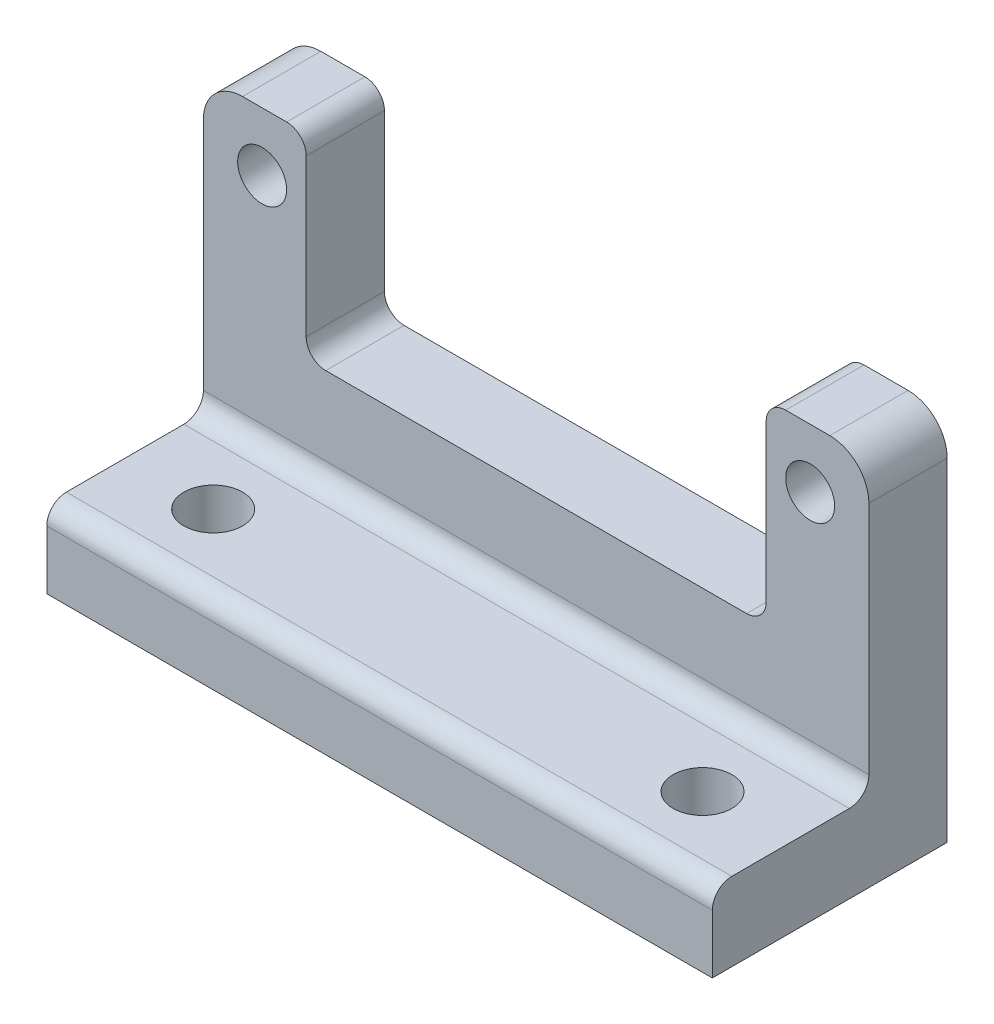
ISO-10303-21;
HEADER;
FILE_DESCRIPTION(('STEP AP214'),'2;1');
FILE_NAME('part.step','',(''),(''),'','','');
FILE_SCHEMA(('AUTOMOTIVE_DESIGN { 1 0 10303 214 1 1 1 1 }'));
ENDSEC;
DATA;
#1=APPLICATION_CONTEXT('core data for automotive mechanical design processes');
#2=APPLICATION_PROTOCOL_DEFINITION('international standard','automotive_design',2000,#1);
#3=PRODUCT_CONTEXT('',#1,'mechanical');
#4=PRODUCT('Part','Part','',(#3));
#5=PRODUCT_RELATED_PRODUCT_CATEGORY('part','',(#4));
#6=PRODUCT_DEFINITION_FORMATION('','',#4);
#7=PRODUCT_DEFINITION_CONTEXT('part definition',#1,'design');
#8=PRODUCT_DEFINITION('design','',#6,#7);
#9=PRODUCT_DEFINITION_SHAPE('','',#8);
#10=(LENGTH_UNIT() NAMED_UNIT(*) SI_UNIT(.MILLI.,.METRE.));
#11=(NAMED_UNIT(*) PLANE_ANGLE_UNIT() SI_UNIT($,.RADIAN.));
#12=(NAMED_UNIT(*) SI_UNIT($,.STERADIAN.) SOLID_ANGLE_UNIT());
#13=UNCERTAINTY_MEASURE_WITH_UNIT(LENGTH_MEASURE(1.E-05),#10,'distance_accuracy_value','');
#14=(GEOMETRIC_REPRESENTATION_CONTEXT(3) GLOBAL_UNCERTAINTY_ASSIGNED_CONTEXT((#13)) GLOBAL_UNIT_ASSIGNED_CONTEXT((#10,
#11,#12)) REPRESENTATION_CONTEXT('',''));
#15=CARTESIAN_POINT('',(0.,0.,0.));
#16=DIRECTION('',(0.,0.,1.));
#17=DIRECTION('',(1.,0.,0.));
#18=AXIS2_PLACEMENT_3D('',#15,#16,#17);
#19=CARTESIAN_POINT('',(0.,19.,0.));
#20=DIRECTION('',(0.,1.,0.));
#21=DIRECTION('',(0.,0.,1.));
#22=AXIS2_PLACEMENT_3D('',#19,#20,#21);
#23=PLANE('',#22);
#24=DIRECTION('',(-1.,0.,0.));
#25=VECTOR('',#24,1.);
#26=CARTESIAN_POINT('',(0.,19.,0.));
#27=LINE('',#26,#25);
#28=CARTESIAN_POINT('',(32.,19.,0.));
#29=VERTEX_POINT('',#28);
#30=CARTESIAN_POINT('',(29.75,19.,0.));
#31=VERTEX_POINT('',#30);
#32=EDGE_CURVE('E285',#29,#31,#27,.T.);
#33=ORIENTED_EDGE('',*,*,#32,.T.);
#34=DIRECTION('',(0.,0.,1.));
#35=VECTOR('',#34,1.);
#36=CARTESIAN_POINT('',(29.75,19.,0.));
#37=LINE('',#36,#35);
#38=CARTESIAN_POINT('',(29.75,19.,4.));
#39=VERTEX_POINT('',#38);
#40=EDGE_CURVE('E264',#31,#39,#37,.T.);
#41=ORIENTED_EDGE('',*,*,#40,.T.);
#42=DIRECTION('',(1.,0.,0.));
#43=VECTOR('',#42,1.);
#44=CARTESIAN_POINT('',(0.,19.,4.));
#45=LINE('',#44,#43);
#46=CARTESIAN_POINT('',(32.,19.,4.));
#47=VERTEX_POINT('',#46);
#48=EDGE_CURVE('E317',#39,#47,#45,.T.);
#49=ORIENTED_EDGE('',*,*,#48,.T.);
#50=DIRECTION('',(0.,0.,-1.));
#51=VECTOR('',#50,1.);
#52=CARTESIAN_POINT('',(32.,19.,0.));
#53=LINE('',#52,#51);
#54=EDGE_CURVE('E220',#47,#29,#53,.T.);
#55=ORIENTED_EDGE('',*,*,#54,.T.);
#56=EDGE_LOOP('',(#33,#41,#49,#55));
#57=FACE_BOUND('',#56,.T.);
#58=ADVANCED_FACE('F33',(#57),#23,.T.);
#59=CARTESIAN_POINT('',(0.,4.,0.));
#60=DIRECTION('',(0.,1.,0.));
#61=DIRECTION('',(0.,0.,1.));
#62=AXIS2_PLACEMENT_3D('',#59,#60,#61);
#63=PLANE('',#62);
#64=DIRECTION('',(0.,0.,-1.));
#65=VECTOR('',#64,1.);
#66=CARTESIAN_POINT('',(34.,4.,0.));
#67=LINE('',#66,#65);
#68=CARTESIAN_POINT('',(34.,4.,11.));
#69=VERTEX_POINT('',#68);
#70=CARTESIAN_POINT('',(34.,4.,5.));
#71=VERTEX_POINT('',#70);
#72=EDGE_CURVE('E192',#69,#71,#67,.T.);
#73=ORIENTED_EDGE('',*,*,#72,.T.);
#74=DIRECTION('',(1.,0.,0.));
#75=VECTOR('',#74,1.);
#76=CARTESIAN_POINT('',(0.,4.,5.));
#77=LINE('',#76,#75);
#78=CARTESIAN_POINT('',(0.,4.,5.));
#79=VERTEX_POINT('',#78);
#80=EDGE_CURVE('E54',#71,#79,#77,.F.);
#81=ORIENTED_EDGE('',*,*,#80,.T.);
#82=DIRECTION('',(0.,0.,1.));
#83=VECTOR('',#82,1.);
#84=CARTESIAN_POINT('',(0.,4.,0.));
#85=LINE('',#84,#83);
#86=CARTESIAN_POINT('',(0.,4.,11.));
#87=VERTEX_POINT('',#86);
#88=EDGE_CURVE('E198',#79,#87,#85,.T.);
#89=ORIENTED_EDGE('',*,*,#88,.T.);
#90=DIRECTION('',(1.,0.,0.));
#91=VECTOR('',#90,1.);
#92=CARTESIAN_POINT('',(34.,4.,11.));
#93=LINE('',#92,#91);
#94=EDGE_CURVE('E169',#87,#69,#93,.T.);
#95=ORIENTED_EDGE('',*,*,#94,.T.);
#96=EDGE_LOOP('',(#73,#81,#89,#95));
#97=FACE_BOUND('',#96,.T.);
#98=CARTESIAN_POINT('',(4.5,4.,8.));
#99=DIRECTION('',(0.,1.,0.));
#100=DIRECTION('',(0.,0.,1.));
#101=AXIS2_PLACEMENT_3D('',#98,#99,#100);
#102=CIRCLE('',#101,1.5);
#103=CARTESIAN_POINT('',(4.5,4.,9.5));
#104=VERTEX_POINT('',#103);
#105=EDGE_CURVE('E186',#104,#104,#102,.T.);
#106=ORIENTED_EDGE('',*,*,#105,.F.);
#107=EDGE_LOOP('',(#106));
#108=FACE_BOUND('',#107,.T.);
#109=CARTESIAN_POINT('',(29.5,4.,8.));
#110=DIRECTION('',(0.,1.,0.));
#111=DIRECTION('',(0.,0.,1.));
#112=AXIS2_PLACEMENT_3D('',#109,#110,#111);
#113=CIRCLE('',#112,1.5);
#114=CARTESIAN_POINT('',(29.5,4.,9.50000000000001));
#115=VERTEX_POINT('',#114);
#116=EDGE_CURVE('E294',#115,#115,#113,.T.);
#117=ORIENTED_EDGE('',*,*,#116,.F.);
#118=EDGE_LOOP('',(#117));
#119=FACE_BOUND('',#118,.T.);
#120=ADVANCED_FACE('F300',(#97,#108,#119),#63,.T.);
#121=CARTESIAN_POINT('',(0.,0.,0.));
#122=DIRECTION('',(0.,1.,0.));
#123=DIRECTION('',(0.,0.,1.));
#124=AXIS2_PLACEMENT_3D('',#121,#122,#123);
#125=PLANE('',#124);
#126=DIRECTION('',(0.,0.,1.));
#127=VECTOR('',#126,1.);
#128=CARTESIAN_POINT('',(0.,0.,0.));
#129=LINE('',#128,#127);
#130=CARTESIAN_POINT('',(0.,0.,0.));
#131=VERTEX_POINT('',#130);
#132=CARTESIAN_POINT('',(0.,0.,12.));
#133=VERTEX_POINT('',#132);
#134=EDGE_CURVE('E177',#131,#133,#129,.T.);
#135=ORIENTED_EDGE('',*,*,#134,.F.);
#136=DIRECTION('',(-1.,0.,0.));
#137=VECTOR('',#136,1.);
#138=CARTESIAN_POINT('',(0.,0.,0.));
#139=LINE('',#138,#137);
#140=CARTESIAN_POINT('',(34.,0.,0.));
#141=VERTEX_POINT('',#140);
#142=EDGE_CURVE('E196',#141,#131,#139,.T.);
#143=ORIENTED_EDGE('',*,*,#142,.F.);
#144=DIRECTION('',(0.,0.,-1.));
#145=VECTOR('',#144,1.);
#146=CARTESIAN_POINT('',(34.,0.,0.));
#147=LINE('',#146,#145);
#148=CARTESIAN_POINT('',(34.,0.,12.));
#149=VERTEX_POINT('',#148);
#150=EDGE_CURVE('E179',#149,#141,#147,.T.);
#151=ORIENTED_EDGE('',*,*,#150,.F.);
#152=DIRECTION('',(1.,0.,0.));
#153=VECTOR('',#152,1.);
#154=CARTESIAN_POINT('',(0.,0.,12.));
#155=LINE('',#154,#153);
#156=EDGE_CURVE('E161',#133,#149,#155,.T.);
#157=ORIENTED_EDGE('',*,*,#156,.F.);
#158=EDGE_LOOP('',(#135,#143,#151,#157));
#159=FACE_BOUND('',#158,.T.);
#160=CARTESIAN_POINT('',(4.5,0.,8.));
#161=DIRECTION('',(0.,1.,0.));
#162=DIRECTION('',(0.,0.,1.));
#163=AXIS2_PLACEMENT_3D('',#160,#161,#162);
#164=CIRCLE('',#163,1.5);
#165=CARTESIAN_POINT('',(4.5,0.,9.5));
#166=VERTEX_POINT('',#165);
#167=EDGE_CURVE('E189',#166,#166,#164,.T.);
#168=ORIENTED_EDGE('',*,*,#167,.T.);
#169=EDGE_LOOP('',(#168));
#170=FACE_BOUND('',#169,.T.);
#171=CARTESIAN_POINT('',(29.5,0.,8.));
#172=DIRECTION('',(0.,1.,0.));
#173=DIRECTION('',(0.,0.,1.));
#174=AXIS2_PLACEMENT_3D('',#171,#172,#173);
#175=CIRCLE('',#174,1.5);
#176=CARTESIAN_POINT('',(29.5,0.,9.50000000000001));
#177=VERTEX_POINT('',#176);
#178=EDGE_CURVE('E287',#177,#177,#175,.T.);
#179=ORIENTED_EDGE('',*,*,#178,.T.);
#180=EDGE_LOOP('',(#179));
#181=FACE_BOUND('',#180,.T.);
#182=ADVANCED_FACE('F174',(#159,#170,#181),#125,.F.);
#183=CARTESIAN_POINT('',(0.,4.,0.));
#184=DIRECTION('',(1.,0.,0.));
#185=DIRECTION('',(0.,0.,-1.));
#186=AXIS2_PLACEMENT_3D('',#183,#184,#185);
#187=PLANE('',#186);
#188=DIRECTION('',(0.,-1.,0.));
#189=VECTOR('',#188,1.);
#190=CARTESIAN_POINT('',(0.,19.,4.));
#191=LINE('',#190,#189);
#192=CARTESIAN_POINT('',(0.,17.,4.));
#193=VERTEX_POINT('',#192);
#194=CARTESIAN_POINT('',(0.,5.,4.));
#195=VERTEX_POINT('',#194);
#196=EDGE_CURVE('E279',#193,#195,#191,.T.);
#197=ORIENTED_EDGE('',*,*,#196,.F.);
#198=DIRECTION('',(0.,0.,1.));
#199=VECTOR('',#198,1.);
#200=CARTESIAN_POINT('',(0.,17.,0.));
#201=LINE('',#200,#199);
#202=CARTESIAN_POINT('',(0.,17.,0.));
#203=VERTEX_POINT('',#202);
#204=EDGE_CURVE('E215',#193,#203,#201,.F.);
#205=ORIENTED_EDGE('',*,*,#204,.T.);
#206=DIRECTION('',(0.,-1.,0.));
#207=VECTOR('',#206,1.);
#208=CARTESIAN_POINT('',(0.,4.,0.));
#209=LINE('',#208,#207);
#210=EDGE_CURVE('E184',#203,#131,#209,.T.);
#211=ORIENTED_EDGE('',*,*,#210,.T.);
#212=ORIENTED_EDGE('',*,*,#134,.T.);
#213=DIRECTION('',(0.,-1.,0.));
#214=VECTOR('',#213,1.);
#215=CARTESIAN_POINT('',(0.,4.,12.));
#216=LINE('',#215,#214);
#217=CARTESIAN_POINT('',(0.,3.,12.));
#218=VERTEX_POINT('',#217);
#219=EDGE_CURVE('E157',#218,#133,#216,.T.);
#220=ORIENTED_EDGE('',*,*,#219,.F.);
#221=CARTESIAN_POINT('',(0.,3.,11.));
#222=DIRECTION('',(1.,0.,0.));
#223=DIRECTION('',(0.,0.,-1.));
#224=AXIS2_PLACEMENT_3D('',#221,#222,#223);
#225=CIRCLE('',#224,1.);
#226=EDGE_CURVE('E208',#218,#87,#225,.F.);
#227=ORIENTED_EDGE('',*,*,#226,.T.);
#228=ORIENTED_EDGE('',*,*,#88,.F.);
#229=CARTESIAN_POINT('',(0.,5.,5.));
#230=DIRECTION('',(1.,0.,0.));
#231=DIRECTION('',(0.,0.,-1.));
#232=AXIS2_PLACEMENT_3D('',#229,#230,#231);
#233=CIRCLE('',#232,1.);
#234=EDGE_CURVE('E11',#79,#195,#233,.T.);
#235=ORIENTED_EDGE('',*,*,#234,.T.);
#236=EDGE_LOOP('',(#197,#205,#211,#212,#220,#227,#228,#235));
#237=FACE_BOUND('',#236,.T.);
#238=ADVANCED_FACE('F182',(#237),#187,.F.);
#239=CARTESIAN_POINT('',(0.,4.,12.));
#240=DIRECTION('',(0.,0.,-1.));
#241=DIRECTION('',(-1.,0.,0.));
#242=AXIS2_PLACEMENT_3D('',#239,#240,#241);
#243=PLANE('',#242);
#244=DIRECTION('',(0.,-1.,0.));
#245=VECTOR('',#244,1.);
#246=CARTESIAN_POINT('',(34.,4.,12.));
#247=LINE('',#246,#245);
#248=CARTESIAN_POINT('',(34.,3.,12.));
#249=VERTEX_POINT('',#248);
#250=EDGE_CURVE('E170',#249,#149,#247,.T.);
#251=ORIENTED_EDGE('',*,*,#250,.F.);
#252=DIRECTION('',(1.,0.,0.));
#253=VECTOR('',#252,1.);
#254=CARTESIAN_POINT('',(0.,3.,12.));
#255=LINE('',#254,#253);
#256=EDGE_CURVE('E164',#249,#218,#255,.F.);
#257=ORIENTED_EDGE('',*,*,#256,.T.);
#258=ORIENTED_EDGE('',*,*,#219,.T.);
#259=ORIENTED_EDGE('',*,*,#156,.T.);
#260=EDGE_LOOP('',(#251,#257,#258,#259));
#261=FACE_BOUND('',#260,.T.);
#262=ADVANCED_FACE('F160',(#261),#243,.F.);
#263=CARTESIAN_POINT('',(34.,4.,0.));
#264=DIRECTION('',(-1.,0.,0.));
#265=DIRECTION('',(0.,0.,1.));
#266=AXIS2_PLACEMENT_3D('',#263,#264,#265);
#267=PLANE('',#266);
#268=DIRECTION('',(0.,-1.,0.));
#269=VECTOR('',#268,1.);
#270=CARTESIAN_POINT('',(34.,4.,0.));
#271=LINE('',#270,#269);
#272=CARTESIAN_POINT('',(34.,17.,0.));
#273=VERTEX_POINT('',#272);
#274=EDGE_CURVE('E200',#273,#141,#271,.T.);
#275=ORIENTED_EDGE('',*,*,#274,.F.);
#276=DIRECTION('',(0.,0.,-1.));
#277=VECTOR('',#276,1.);
#278=CARTESIAN_POINT('',(34.,17.,4.));
#279=LINE('',#278,#277);
#280=CARTESIAN_POINT('',(34.,17.,4.));
#281=VERTEX_POINT('',#280);
#282=EDGE_CURVE('E225',#273,#281,#279,.F.);
#283=ORIENTED_EDGE('',*,*,#282,.T.);
#284=DIRECTION('',(0.,-1.,0.));
#285=VECTOR('',#284,1.);
#286=CARTESIAN_POINT('',(34.,19.,4.));
#287=LINE('',#286,#285);
#288=CARTESIAN_POINT('',(34.,5.,4.));
#289=VERTEX_POINT('',#288);
#290=EDGE_CURVE('E277',#281,#289,#287,.T.);
#291=ORIENTED_EDGE('',*,*,#290,.T.);
#292=CARTESIAN_POINT('',(34.,5.,5.));
#293=DIRECTION('',(-1.,0.,0.));
#294=DIRECTION('',(0.,0.,1.));
#295=AXIS2_PLACEMENT_3D('',#292,#293,#294);
#296=CIRCLE('',#295,1.);
#297=EDGE_CURVE('E41',#289,#71,#296,.T.);
#298=ORIENTED_EDGE('',*,*,#297,.T.);
#299=ORIENTED_EDGE('',*,*,#72,.F.);
#300=CARTESIAN_POINT('',(34.,3.,11.));
#301=DIRECTION('',(-1.,0.,0.));
#302=DIRECTION('',(0.,0.,1.));
#303=AXIS2_PLACEMENT_3D('',#300,#301,#302);
#304=CIRCLE('',#303,1.);
#305=EDGE_CURVE('E205',#69,#249,#304,.F.);
#306=ORIENTED_EDGE('',*,*,#305,.T.);
#307=ORIENTED_EDGE('',*,*,#250,.T.);
#308=ORIENTED_EDGE('',*,*,#150,.T.);
#309=EDGE_LOOP('',(#275,#283,#291,#298,#299,#306,#307,#308));
#310=FACE_BOUND('',#309,.T.);
#311=ADVANCED_FACE('F283',(#310),#267,.F.);
#312=CARTESIAN_POINT('',(0.,4.,0.));
#313=DIRECTION('',(0.,0.,1.));
#314=DIRECTION('',(1.,0.,0.));
#315=AXIS2_PLACEMENT_3D('',#312,#313,#314);
#316=PLANE('',#315);
#317=CARTESIAN_POINT('',(3.,16.,0.));
#318=DIRECTION('',(0.,0.,1.));
#319=DIRECTION('',(1.,0.,0.));
#320=AXIS2_PLACEMENT_3D('',#317,#318,#319);
#321=CIRCLE('',#320,1.25);
#322=CARTESIAN_POINT('',(4.25,16.,0.));
#323=VERTEX_POINT('',#322);
#324=EDGE_CURVE('E336',#323,#323,#321,.T.);
#325=ORIENTED_EDGE('',*,*,#324,.T.);
#326=EDGE_LOOP('',(#325));
#327=FACE_BOUND('',#326,.T.);
#328=CARTESIAN_POINT('',(31.,16.,0.));
#329=DIRECTION('',(0.,0.,1.));
#330=DIRECTION('',(1.,0.,0.));
#331=AXIS2_PLACEMENT_3D('',#328,#329,#330);
#332=CIRCLE('',#331,1.25);
#333=CARTESIAN_POINT('',(32.25,16.,0.));
#334=VERTEX_POINT('',#333);
#335=EDGE_CURVE('E342',#334,#334,#332,.T.);
#336=ORIENTED_EDGE('',*,*,#335,.T.);
#337=EDGE_LOOP('',(#336));
#338=FACE_BOUND('',#337,.T.);
#339=CARTESIAN_POINT('',(4.25,19.,0.));
#340=VERTEX_POINT('',#339);
#341=CARTESIAN_POINT('',(2.,19.,0.));
#342=VERTEX_POINT('',#341);
#343=EDGE_CURVE('E290',#340,#342,#27,.T.);
#344=ORIENTED_EDGE('',*,*,#343,.F.);
#345=CARTESIAN_POINT('',(4.25,18.,0.));
#346=DIRECTION('',(0.,0.,1.));
#347=DIRECTION('',(1.,0.,0.));
#348=AXIS2_PLACEMENT_3D('',#345,#346,#347);
#349=CIRCLE('',#348,1.);
#350=CARTESIAN_POINT('',(5.25,18.,0.));
#351=VERTEX_POINT('',#350);
#352=EDGE_CURVE('E262',#340,#351,#349,.F.);
#353=ORIENTED_EDGE('',*,*,#352,.T.);
#354=DIRECTION('',(0.,-1.,0.));
#355=VECTOR('',#354,1.);
#356=CARTESIAN_POINT('',(5.25,19.,0.));
#357=LINE('',#356,#355);
#358=CARTESIAN_POINT('',(5.25,10.,0.));
#359=VERTEX_POINT('',#358);
#360=EDGE_CURVE('E319',#351,#359,#357,.T.);
#361=ORIENTED_EDGE('',*,*,#360,.T.);
#362=CARTESIAN_POINT('',(6.25,10.,0.));
#363=DIRECTION('',(0.,0.,1.));
#364=DIRECTION('',(1.,0.,0.));
#365=AXIS2_PLACEMENT_3D('',#362,#363,#364);
#366=CIRCLE('',#365,1.);
#367=CARTESIAN_POINT('',(6.25,9.,0.));
#368=VERTEX_POINT('',#367);
#369=EDGE_CURVE('E239',#359,#368,#366,.T.);
#370=ORIENTED_EDGE('',*,*,#369,.T.);
#371=DIRECTION('',(1.,0.,0.));
#372=VECTOR('',#371,1.);
#373=CARTESIAN_POINT('',(5.25,9.,0.));
#374=LINE('',#373,#372);
#375=CARTESIAN_POINT('',(27.75,9.00000000000001,0.));
#376=VERTEX_POINT('',#375);
#377=EDGE_CURVE('E326',#368,#376,#374,.T.);
#378=ORIENTED_EDGE('',*,*,#377,.T.);
#379=CARTESIAN_POINT('',(27.75,10.,0.));
#380=DIRECTION('',(0.,0.,1.));
#381=DIRECTION('',(1.,0.,0.));
#382=AXIS2_PLACEMENT_3D('',#379,#380,#381);
#383=CIRCLE('',#382,1.);
#384=CARTESIAN_POINT('',(28.75,10.,0.));
#385=VERTEX_POINT('',#384);
#386=EDGE_CURVE('E248',#376,#385,#383,.T.);
#387=ORIENTED_EDGE('',*,*,#386,.T.);
#388=DIRECTION('',(0.,-1.,0.));
#389=VECTOR('',#388,1.);
#390=CARTESIAN_POINT('',(28.75,19.,0.));
#391=LINE('',#390,#389);
#392=CARTESIAN_POINT('',(28.75,18.,0.));
#393=VERTEX_POINT('',#392);
#394=EDGE_CURVE('E321',#393,#385,#391,.T.);
#395=ORIENTED_EDGE('',*,*,#394,.F.);
#396=CARTESIAN_POINT('',(29.75,18.,0.));
#397=DIRECTION('',(0.,0.,1.));
#398=DIRECTION('',(1.,0.,0.));
#399=AXIS2_PLACEMENT_3D('',#396,#397,#398);
#400=CIRCLE('',#399,1.);
#401=EDGE_CURVE('E260',#393,#31,#400,.F.);
#402=ORIENTED_EDGE('',*,*,#401,.T.);
#403=ORIENTED_EDGE('',*,*,#32,.F.);
#404=CARTESIAN_POINT('',(32.,17.,0.));
#405=DIRECTION('',(0.,0.,1.));
#406=DIRECTION('',(1.,0.,0.));
#407=AXIS2_PLACEMENT_3D('',#404,#405,#406);
#408=CIRCLE('',#407,2.);
#409=EDGE_CURVE('E223',#29,#273,#408,.F.);
#410=ORIENTED_EDGE('',*,*,#409,.T.);
#411=ORIENTED_EDGE('',*,*,#274,.T.);
#412=ORIENTED_EDGE('',*,*,#142,.T.);
#413=ORIENTED_EDGE('',*,*,#210,.F.);
#414=CARTESIAN_POINT('',(2.,17.,0.));
#415=DIRECTION('',(0.,0.,1.));
#416=DIRECTION('',(1.,0.,0.));
#417=AXIS2_PLACEMENT_3D('',#414,#415,#416);
#418=CIRCLE('',#417,2.);
#419=EDGE_CURVE('E217',#203,#342,#418,.F.);
#420=ORIENTED_EDGE('',*,*,#419,.T.);
#421=EDGE_LOOP('',(#344,#353,#361,#370,#378,#387,#395,#402,#403,#410,#411,#412,#413,#420));
#422=FACE_BOUND('',#421,.T.);
#423=ADVANCED_FACE('F308',(#327,#338,#422),#316,.F.);
#424=CARTESIAN_POINT('',(4.5,4.,8.));
#425=DIRECTION('',(0.,-1.,0.));
#426=DIRECTION('',(0.,0.,-1.));
#427=AXIS2_PLACEMENT_3D('',#424,#425,#426);
#428=CYLINDRICAL_SURFACE('',#427,1.5);
#429=ORIENTED_EDGE('',*,*,#105,.T.);
#430=EDGE_LOOP('',(#429));
#431=FACE_BOUND('',#430,.T.);
#432=ORIENTED_EDGE('',*,*,#167,.F.);
#433=EDGE_LOOP('',(#432));
#434=FACE_BOUND('',#433,.T.);
#435=ADVANCED_FACE('F362',(#431,#434),#428,.F.);
#436=CARTESIAN_POINT('',(29.5,4.,8.));
#437=DIRECTION('',(0.,-1.,0.));
#438=DIRECTION('',(0.,0.,-1.));
#439=AXIS2_PLACEMENT_3D('',#436,#437,#438);
#440=CYLINDRICAL_SURFACE('',#439,1.5);
#441=ORIENTED_EDGE('',*,*,#116,.T.);
#442=EDGE_LOOP('',(#441));
#443=FACE_BOUND('',#442,.T.);
#444=ORIENTED_EDGE('',*,*,#178,.F.);
#445=EDGE_LOOP('',(#444));
#446=FACE_BOUND('',#445,.T.);
#447=ADVANCED_FACE('F352',(#443,#446),#440,.F.);
#448=CARTESIAN_POINT('',(0.,19.,4.));
#449=DIRECTION('',(0.,0.,-1.));
#450=DIRECTION('',(-1.,0.,0.));
#451=AXIS2_PLACEMENT_3D('',#448,#449,#450);
#452=PLANE('',#451);
#453=CARTESIAN_POINT('',(3.,16.,4.));
#454=DIRECTION('',(0.,0.,1.));
#455=DIRECTION('',(1.,0.,0.));
#456=AXIS2_PLACEMENT_3D('',#453,#454,#455);
#457=CIRCLE('',#456,1.25);
#458=CARTESIAN_POINT('',(4.25,16.,4.));
#459=VERTEX_POINT('',#458);
#460=EDGE_CURVE('E339',#459,#459,#457,.T.);
#461=ORIENTED_EDGE('',*,*,#460,.F.);
#462=EDGE_LOOP('',(#461));
#463=FACE_BOUND('',#462,.T.);
#464=CARTESIAN_POINT('',(31.,16.,4.));
#465=DIRECTION('',(0.,0.,1.));
#466=DIRECTION('',(1.,0.,0.));
#467=AXIS2_PLACEMENT_3D('',#464,#465,#466);
#468=CIRCLE('',#467,1.25);
#469=CARTESIAN_POINT('',(32.25,16.,4.));
#470=VERTEX_POINT('',#469);
#471=EDGE_CURVE('E331',#470,#470,#468,.T.);
#472=ORIENTED_EDGE('',*,*,#471,.F.);
#473=EDGE_LOOP('',(#472));
#474=FACE_BOUND('',#473,.T.);
#475=ORIENTED_EDGE('',*,*,#196,.T.);
#476=DIRECTION('',(1.,0.,0.));
#477=VECTOR('',#476,1.);
#478=CARTESIAN_POINT('',(0.,5.,4.));
#479=LINE('',#478,#477);
#480=EDGE_CURVE('E269',#195,#289,#479,.T.);
#481=ORIENTED_EDGE('',*,*,#480,.T.);
#482=ORIENTED_EDGE('',*,*,#290,.F.);
#483=CARTESIAN_POINT('',(32.,17.,4.));
#484=DIRECTION('',(0.,0.,-1.));
#485=DIRECTION('',(-1.,0.,0.));
#486=AXIS2_PLACEMENT_3D('',#483,#484,#485);
#487=CIRCLE('',#486,2.);
#488=EDGE_CURVE('E227',#281,#47,#487,.F.);
#489=ORIENTED_EDGE('',*,*,#488,.T.);
#490=ORIENTED_EDGE('',*,*,#48,.F.);
#491=CARTESIAN_POINT('',(29.75,18.,4.));
#492=DIRECTION('',(0.,0.,-1.));
#493=DIRECTION('',(-1.,0.,0.));
#494=AXIS2_PLACEMENT_3D('',#491,#492,#493);
#495=CIRCLE('',#494,1.);
#496=CARTESIAN_POINT('',(28.75,18.,4.));
#497=VERTEX_POINT('',#496);
#498=EDGE_CURVE('E254',#39,#497,#495,.F.);
#499=ORIENTED_EDGE('',*,*,#498,.T.);
#500=DIRECTION('',(0.,-1.,0.));
#501=VECTOR('',#500,1.);
#502=CARTESIAN_POINT('',(28.75,19.,4.));
#503=LINE('',#502,#501);
#504=CARTESIAN_POINT('',(28.75,10.,4.));
#505=VERTEX_POINT('',#504);
#506=EDGE_CURVE('E327',#497,#505,#503,.T.);
#507=ORIENTED_EDGE('',*,*,#506,.T.);
#508=CARTESIAN_POINT('',(27.75,10.,4.));
#509=DIRECTION('',(0.,0.,-1.));
#510=DIRECTION('',(-1.,0.,0.));
#511=AXIS2_PLACEMENT_3D('',#508,#509,#510);
#512=CIRCLE('',#511,1.);
#513=CARTESIAN_POINT('',(27.75,9.00000000000001,4.));
#514=VERTEX_POINT('',#513);
#515=EDGE_CURVE('E246',#505,#514,#512,.T.);
#516=ORIENTED_EDGE('',*,*,#515,.T.);
#517=DIRECTION('',(1.,0.,0.));
#518=VECTOR('',#517,1.);
#519=CARTESIAN_POINT('',(5.25,9.,4.));
#520=LINE('',#519,#518);
#521=CARTESIAN_POINT('',(6.25,9.,4.));
#522=VERTEX_POINT('',#521);
#523=EDGE_CURVE('E329',#522,#514,#520,.T.);
#524=ORIENTED_EDGE('',*,*,#523,.F.);
#525=CARTESIAN_POINT('',(6.25,10.,4.));
#526=DIRECTION('',(0.,0.,-1.));
#527=DIRECTION('',(-1.,0.,0.));
#528=AXIS2_PLACEMENT_3D('',#525,#526,#527);
#529=CIRCLE('',#528,1.);
#530=CARTESIAN_POINT('',(5.25,10.,4.));
#531=VERTEX_POINT('',#530);
#532=EDGE_CURVE('E236',#522,#531,#529,.T.);
#533=ORIENTED_EDGE('',*,*,#532,.T.);
#534=DIRECTION('',(0.,-1.,0.));
#535=VECTOR('',#534,1.);
#536=CARTESIAN_POINT('',(5.25,19.,4.));
#537=LINE('',#536,#535);
#538=CARTESIAN_POINT('',(5.25,18.,4.));
#539=VERTEX_POINT('',#538);
#540=EDGE_CURVE('E324',#539,#531,#537,.T.);
#541=ORIENTED_EDGE('',*,*,#540,.F.);
#542=CARTESIAN_POINT('',(4.25,18.,4.));
#543=DIRECTION('',(0.,0.,-1.));
#544=DIRECTION('',(-1.,0.,0.));
#545=AXIS2_PLACEMENT_3D('',#542,#543,#544);
#546=CIRCLE('',#545,1.);
#547=CARTESIAN_POINT('',(4.25,19.,4.));
#548=VERTEX_POINT('',#547);
#549=EDGE_CURVE('E256',#539,#548,#546,.F.);
#550=ORIENTED_EDGE('',*,*,#549,.T.);
#551=CARTESIAN_POINT('',(2.,19.,4.));
#552=VERTEX_POINT('',#551);
#553=EDGE_CURVE('E318',#552,#548,#45,.T.);
#554=ORIENTED_EDGE('',*,*,#553,.F.);
#555=CARTESIAN_POINT('',(2.,17.,4.));
#556=DIRECTION('',(0.,0.,-1.));
#557=DIRECTION('',(-1.,0.,0.));
#558=AXIS2_PLACEMENT_3D('',#555,#556,#557);
#559=CIRCLE('',#558,2.);
#560=EDGE_CURVE('E213',#552,#193,#559,.F.);
#561=ORIENTED_EDGE('',*,*,#560,.T.);
#562=EDGE_LOOP('',(#475,#481,#482,#489,#490,#499,#507,#516,#524,#533,#541,#550,#554,#561));
#563=FACE_BOUND('',#562,.T.);
#564=ADVANCED_FACE('F276',(#463,#474,#563),#452,.F.);
#565=ORIENTED_EDGE('',*,*,#553,.T.);
#566=DIRECTION('',(0.,0.,1.));
#567=VECTOR('',#566,1.);
#568=CARTESIAN_POINT('',(4.25,19.,0.));
#569=LINE('',#568,#567);
#570=EDGE_CURVE('E258',#548,#340,#569,.F.);
#571=ORIENTED_EDGE('',*,*,#570,.T.);
#572=ORIENTED_EDGE('',*,*,#343,.T.);
#573=DIRECTION('',(0.,0.,1.));
#574=VECTOR('',#573,1.);
#575=CARTESIAN_POINT('',(2.,19.,4.));
#576=LINE('',#575,#574);
#577=EDGE_CURVE('E210',#342,#552,#576,.T.);
#578=ORIENTED_EDGE('',*,*,#577,.T.);
#579=EDGE_LOOP('',(#565,#571,#572,#578));
#580=FACE_BOUND('',#579,.T.);
#581=ADVANCED_FACE('F351',(#580),#23,.T.);
#582=CARTESIAN_POINT('',(5.25,9.,0.));
#583=DIRECTION('',(0.,-1.,0.));
#584=DIRECTION('',(1.,0.,0.));
#585=AXIS2_PLACEMENT_3D('',#582,#583,#584);
#586=PLANE('',#585);
#587=ORIENTED_EDGE('',*,*,#523,.T.);
#588=DIRECTION('',(0.,0.,1.));
#589=VECTOR('',#588,1.);
#590=CARTESIAN_POINT('',(27.75,9.00000000000001,0.));
#591=LINE('',#590,#589);
#592=EDGE_CURVE('E244',#514,#376,#591,.F.);
#593=ORIENTED_EDGE('',*,*,#592,.T.);
#594=ORIENTED_EDGE('',*,*,#377,.F.);
#595=DIRECTION('',(0.,0.,1.));
#596=VECTOR('',#595,1.);
#597=CARTESIAN_POINT('',(6.25,9.,4.));
#598=LINE('',#597,#596);
#599=EDGE_CURVE('E230',#368,#522,#598,.T.);
#600=ORIENTED_EDGE('',*,*,#599,.T.);
#601=EDGE_LOOP('',(#587,#593,#594,#600));
#602=FACE_BOUND('',#601,.T.);
#603=ADVANCED_FACE('F359',(#602),#586,.F.);
#604=CARTESIAN_POINT('',(5.25,19.,0.));
#605=DIRECTION('',(-1.,0.,0.));
#606=DIRECTION('',(0.,-1.,0.));
#607=AXIS2_PLACEMENT_3D('',#604,#605,#606);
#608=PLANE('',#607);
#609=ORIENTED_EDGE('',*,*,#360,.F.);
#610=DIRECTION('',(0.,0.,1.));
#611=VECTOR('',#610,1.);
#612=CARTESIAN_POINT('',(5.25,18.,4.));
#613=LINE('',#612,#611);
#614=EDGE_CURVE('E251',#351,#539,#613,.T.);
#615=ORIENTED_EDGE('',*,*,#614,.T.);
#616=ORIENTED_EDGE('',*,*,#540,.T.);
#617=DIRECTION('',(0.,0.,1.));
#618=VECTOR('',#617,1.);
#619=CARTESIAN_POINT('',(5.25,10.,0.));
#620=LINE('',#619,#618);
#621=EDGE_CURVE('E233',#531,#359,#620,.F.);
#622=ORIENTED_EDGE('',*,*,#621,.T.);
#623=EDGE_LOOP('',(#609,#615,#616,#622));
#624=FACE_BOUND('',#623,.T.);
#625=ADVANCED_FACE('F374',(#624),#608,.F.);
#626=CARTESIAN_POINT('',(28.75,19.,0.));
#627=DIRECTION('',(-1.,0.,0.));
#628=DIRECTION('',(0.,0.,1.));
#629=AXIS2_PLACEMENT_3D('',#626,#627,#628);
#630=PLANE('',#629);
#631=ORIENTED_EDGE('',*,*,#506,.F.);
#632=DIRECTION('',(0.,0.,1.));
#633=VECTOR('',#632,1.);
#634=CARTESIAN_POINT('',(28.75,18.,0.));
#635=LINE('',#634,#633);
#636=EDGE_CURVE('E267',#497,#393,#635,.F.);
#637=ORIENTED_EDGE('',*,*,#636,.T.);
#638=ORIENTED_EDGE('',*,*,#394,.T.);
#639=DIRECTION('',(0.,0.,1.));
#640=VECTOR('',#639,1.);
#641=CARTESIAN_POINT('',(28.75,10.,0.));
#642=LINE('',#641,#640);
#643=EDGE_CURVE('E241',#385,#505,#642,.T.);
#644=ORIENTED_EDGE('',*,*,#643,.T.);
#645=EDGE_LOOP('',(#631,#637,#638,#644));
#646=FACE_BOUND('',#645,.T.);
#647=ADVANCED_FACE('F376',(#646),#630,.T.);
#648=CARTESIAN_POINT('',(31.,16.,0.));
#649=DIRECTION('',(0.,0.,1.));
#650=DIRECTION('',(1.,0.,0.));
#651=AXIS2_PLACEMENT_3D('',#648,#649,#650);
#652=CYLINDRICAL_SURFACE('',#651,1.25);
#653=ORIENTED_EDGE('',*,*,#335,.F.);
#654=EDGE_LOOP('',(#653));
#655=FACE_BOUND('',#654,.T.);
#656=ORIENTED_EDGE('',*,*,#471,.T.);
#657=EDGE_LOOP('',(#656));
#658=FACE_BOUND('',#657,.T.);
#659=ADVANCED_FACE('F348',(#655,#658),#652,.F.);
#660=CARTESIAN_POINT('',(3.,16.,0.));
#661=DIRECTION('',(0.,0.,1.));
#662=DIRECTION('',(1.,0.,0.));
#663=AXIS2_PLACEMENT_3D('',#660,#661,#662);
#664=CYLINDRICAL_SURFACE('',#663,1.25);
#665=ORIENTED_EDGE('',*,*,#324,.F.);
#666=EDGE_LOOP('',(#665));
#667=FACE_BOUND('',#666,.T.);
#668=ORIENTED_EDGE('',*,*,#460,.T.);
#669=EDGE_LOOP('',(#668));
#670=FACE_BOUND('',#669,.T.);
#671=ADVANCED_FACE('F383',(#667,#670),#664,.F.);
#672=CARTESIAN_POINT('',(0.,3.,11.));
#673=DIRECTION('',(-1.,0.,0.));
#674=DIRECTION('',(0.,0.,1.));
#675=AXIS2_PLACEMENT_3D('',#672,#673,#674);
#676=CYLINDRICAL_SURFACE('',#675,1.);
#677=ORIENTED_EDGE('',*,*,#226,.F.);
#678=ORIENTED_EDGE('',*,*,#256,.F.);
#679=ORIENTED_EDGE('',*,*,#305,.F.);
#680=ORIENTED_EDGE('',*,*,#94,.F.);
#681=EDGE_LOOP('',(#677,#678,#679,#680));
#682=FACE_BOUND('',#681,.T.);
#683=ADVANCED_FACE('F305',(#682),#676,.T.);
#684=CARTESIAN_POINT('',(2.,17.,0.));
#685=DIRECTION('',(0.,0.,-1.));
#686=DIRECTION('',(-1.,0.,0.));
#687=AXIS2_PLACEMENT_3D('',#684,#685,#686);
#688=CYLINDRICAL_SURFACE('',#687,2.);
#689=ORIENTED_EDGE('',*,*,#419,.F.);
#690=ORIENTED_EDGE('',*,*,#204,.F.);
#691=ORIENTED_EDGE('',*,*,#560,.F.);
#692=ORIENTED_EDGE('',*,*,#577,.F.);
#693=EDGE_LOOP('',(#689,#690,#691,#692));
#694=FACE_BOUND('',#693,.T.);
#695=ADVANCED_FACE('F411',(#694),#688,.T.);
#696=CARTESIAN_POINT('',(32.,17.,0.));
#697=DIRECTION('',(0.,0.,1.));
#698=DIRECTION('',(1.,0.,0.));
#699=AXIS2_PLACEMENT_3D('',#696,#697,#698);
#700=CYLINDRICAL_SURFACE('',#699,2.);
#701=ORIENTED_EDGE('',*,*,#488,.F.);
#702=ORIENTED_EDGE('',*,*,#282,.F.);
#703=ORIENTED_EDGE('',*,*,#409,.F.);
#704=ORIENTED_EDGE('',*,*,#54,.F.);
#705=EDGE_LOOP('',(#701,#702,#703,#704));
#706=FACE_BOUND('',#705,.T.);
#707=ADVANCED_FACE('F313',(#706),#700,.T.);
#708=CARTESIAN_POINT('',(6.25,10.,0.));
#709=DIRECTION('',(0.,0.,-1.));
#710=DIRECTION('',(-1.,0.,0.));
#711=AXIS2_PLACEMENT_3D('',#708,#709,#710);
#712=CYLINDRICAL_SURFACE('',#711,1.);
#713=ORIENTED_EDGE('',*,*,#369,.F.);
#714=ORIENTED_EDGE('',*,*,#621,.F.);
#715=ORIENTED_EDGE('',*,*,#532,.F.);
#716=ORIENTED_EDGE('',*,*,#599,.F.);
#717=EDGE_LOOP('',(#713,#714,#715,#716));
#718=FACE_BOUND('',#717,.T.);
#719=ADVANCED_FACE('F417',(#718),#712,.F.);
#720=CARTESIAN_POINT('',(27.75,10.,0.));
#721=DIRECTION('',(0.,0.,1.));
#722=DIRECTION('',(1.,0.,0.));
#723=AXIS2_PLACEMENT_3D('',#720,#721,#722);
#724=CYLINDRICAL_SURFACE('',#723,1.);
#725=ORIENTED_EDGE('',*,*,#386,.F.);
#726=ORIENTED_EDGE('',*,*,#592,.F.);
#727=ORIENTED_EDGE('',*,*,#515,.F.);
#728=ORIENTED_EDGE('',*,*,#643,.F.);
#729=EDGE_LOOP('',(#725,#726,#727,#728));
#730=FACE_BOUND('',#729,.T.);
#731=ADVANCED_FACE('F420',(#730),#724,.F.);
#732=CARTESIAN_POINT('',(4.25,18.,0.));
#733=DIRECTION('',(0.,0.,-1.));
#734=DIRECTION('',(-1.,0.,0.));
#735=AXIS2_PLACEMENT_3D('',#732,#733,#734);
#736=CYLINDRICAL_SURFACE('',#735,1.);
#737=ORIENTED_EDGE('',*,*,#352,.F.);
#738=ORIENTED_EDGE('',*,*,#570,.F.);
#739=ORIENTED_EDGE('',*,*,#549,.F.);
#740=ORIENTED_EDGE('',*,*,#614,.F.);
#741=EDGE_LOOP('',(#737,#738,#739,#740));
#742=FACE_BOUND('',#741,.T.);
#743=ADVANCED_FACE('F424',(#742),#736,.T.);
#744=CARTESIAN_POINT('',(29.75,18.,0.));
#745=DIRECTION('',(0.,0.,1.));
#746=DIRECTION('',(1.,0.,0.));
#747=AXIS2_PLACEMENT_3D('',#744,#745,#746);
#748=CYLINDRICAL_SURFACE('',#747,1.);
#749=ORIENTED_EDGE('',*,*,#401,.F.);
#750=ORIENTED_EDGE('',*,*,#636,.F.);
#751=ORIENTED_EDGE('',*,*,#498,.F.);
#752=ORIENTED_EDGE('',*,*,#40,.F.);
#753=EDGE_LOOP('',(#749,#750,#751,#752));
#754=FACE_BOUND('',#753,.T.);
#755=ADVANCED_FACE('F427',(#754),#748,.T.);
#756=CARTESIAN_POINT('',(0.,5.,5.));
#757=DIRECTION('',(1.,0.,0.));
#758=DIRECTION('',(0.,0.,-1.));
#759=AXIS2_PLACEMENT_3D('',#756,#757,#758);
#760=CYLINDRICAL_SURFACE('',#759,1.);
#761=ORIENTED_EDGE('',*,*,#234,.F.);
#762=ORIENTED_EDGE('',*,*,#80,.F.);
#763=ORIENTED_EDGE('',*,*,#297,.F.);
#764=ORIENTED_EDGE('',*,*,#480,.F.);
#765=EDGE_LOOP('',(#761,#762,#763,#764));
#766=FACE_BOUND('',#765,.T.);
#767=ADVANCED_FACE('F35',(#766),#760,.F.);
#768=CLOSED_SHELL('',(#58,#120,#182,#238,#262,#311,#423,#435,#447,#564,#581,#603,#625,#647,#659,
#671,#683,#695,#707,#719,#731,#743,#755,#767));
#769=MANIFOLD_SOLID_BREP('B2',#768);
#770=ADVANCED_BREP_SHAPE_REPRESENTATION('',(#18,#769),#14);
#771=SHAPE_DEFINITION_REPRESENTATION(#9,#770);
ENDSEC;
END-ISO-10303-21;
